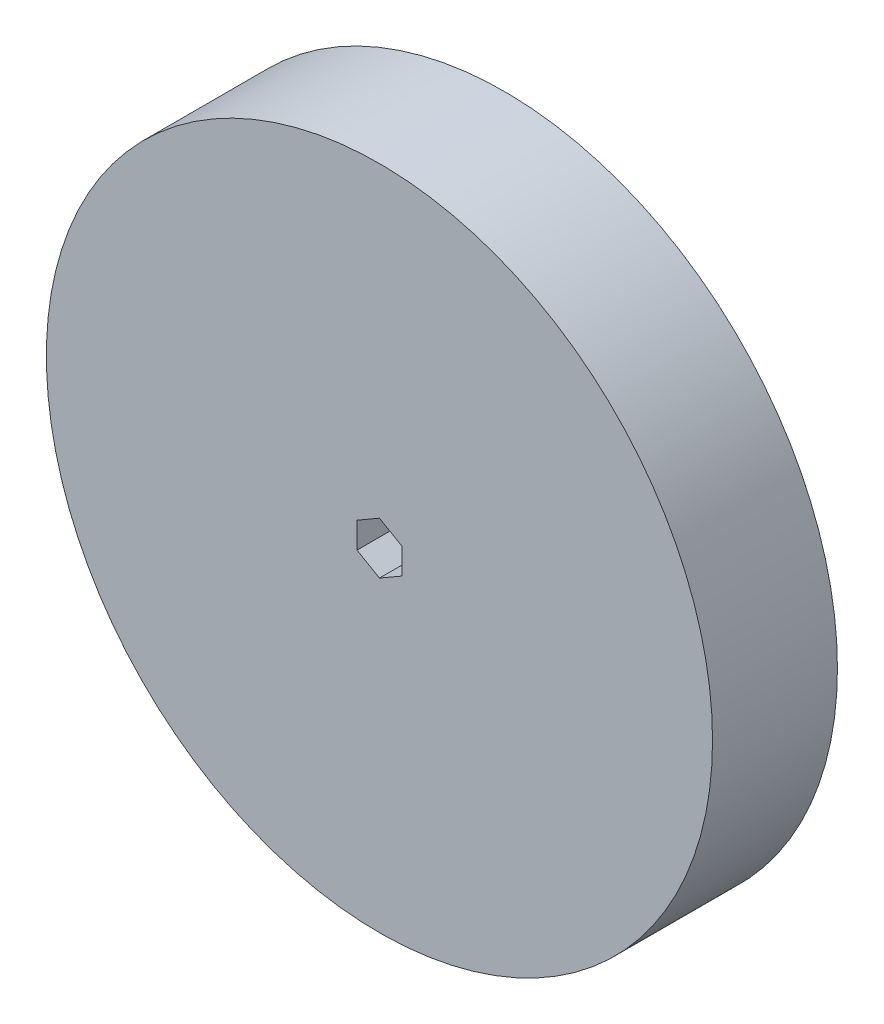
ISO-10303-21;
HEADER;
FILE_DESCRIPTION(('STEP AP214'),'2;1');
FILE_NAME('part.step','',(''),(''),'','','');
FILE_SCHEMA(('AUTOMOTIVE_DESIGN { 1 0 10303 214 1 1 1 1 }'));
ENDSEC;
DATA;
#1=APPLICATION_CONTEXT('core data for automotive mechanical design processes');
#2=APPLICATION_PROTOCOL_DEFINITION('international standard','automotive_design',2000,#1);
#3=PRODUCT_CONTEXT('',#1,'mechanical');
#4=PRODUCT('Part','Part','',(#3));
#5=PRODUCT_RELATED_PRODUCT_CATEGORY('part','',(#4));
#6=PRODUCT_DEFINITION_FORMATION('','',#4);
#7=PRODUCT_DEFINITION_CONTEXT('part definition',#1,'design');
#8=PRODUCT_DEFINITION('design','',#6,#7);
#9=PRODUCT_DEFINITION_SHAPE('','',#8);
#10=(LENGTH_UNIT() NAMED_UNIT(*) SI_UNIT(.MILLI.,.METRE.));
#11=(NAMED_UNIT(*) PLANE_ANGLE_UNIT() SI_UNIT($,.RADIAN.));
#12=(NAMED_UNIT(*) SI_UNIT($,.STERADIAN.) SOLID_ANGLE_UNIT());
#13=UNCERTAINTY_MEASURE_WITH_UNIT(LENGTH_MEASURE(1.E-05),#10,'distance_accuracy_value','');
#14=(GEOMETRIC_REPRESENTATION_CONTEXT(3) GLOBAL_UNCERTAINTY_ASSIGNED_CONTEXT((#13)) GLOBAL_UNIT_ASSIGNED_CONTEXT((#10,
#11,#12)) REPRESENTATION_CONTEXT('',''));
#15=CARTESIAN_POINT('',(0.,0.,0.));
#16=DIRECTION('',(0.,0.,1.));
#17=DIRECTION('',(1.,0.,0.));
#18=AXIS2_PLACEMENT_3D('',#15,#16,#17);
#19=CARTESIAN_POINT('',(0.,0.,-38.1));
#20=DIRECTION('',(0.,0.,1.));
#21=DIRECTION('',(1.,0.,0.));
#22=AXIS2_PLACEMENT_3D('',#19,#20,#21);
#23=CYLINDRICAL_SURFACE('',#22,101.6);
#24=CARTESIAN_POINT('',(0.,0.,-38.1));
#25=DIRECTION('',(0.,0.,1.));
#26=DIRECTION('',(1.,0.,0.));
#27=AXIS2_PLACEMENT_3D('',#24,#25,#26);
#28=CIRCLE('',#27,101.6);
#29=CARTESIAN_POINT('',(101.6,0.,-38.1));
#30=VERTEX_POINT('',#29);
#31=EDGE_CURVE('E11',#30,#30,#28,.T.);
#32=CARTESIAN_POINT('',(0.,0.,0.));
#33=DIRECTION('',(0.,0.,1.));
#34=DIRECTION('',(1.,0.,0.));
#35=AXIS2_PLACEMENT_3D('',#32,#33,#34);
#36=CIRCLE('',#35,101.6);
#37=CARTESIAN_POINT('',(101.6,0.,0.));
#38=VERTEX_POINT('',#37);
#39=EDGE_CURVE('E42',#38,#38,#36,.T.);
#40=CARTESIAN_POINT('',(101.6,0.,-38.1));
#41=CARTESIAN_POINT('',(101.6,0.,-37.703125));
#42=CARTESIAN_POINT('',(101.6,0.,-37.30625));
#43=CARTESIAN_POINT('',(101.6,0.,-36.5125));
#44=CARTESIAN_POINT('',(101.6,0.,-36.115625));
#45=CARTESIAN_POINT('',(101.6,0.,-35.321875));
#46=CARTESIAN_POINT('',(101.6,0.,-34.925));
#47=CARTESIAN_POINT('',(101.6,0.,-34.13125));
#48=CARTESIAN_POINT('',(101.6,0.,-33.734375));
#49=CARTESIAN_POINT('',(101.6,0.,-32.940625));
#50=CARTESIAN_POINT('',(101.6,0.,-32.54375));
#51=CARTESIAN_POINT('',(101.6,0.,-31.75));
#52=CARTESIAN_POINT('',(101.6,0.,-31.353125));
#53=CARTESIAN_POINT('',(101.6,0.,-30.559375));
#54=CARTESIAN_POINT('',(101.6,0.,-30.1625));
#55=CARTESIAN_POINT('',(101.6,0.,-29.36875));
#56=CARTESIAN_POINT('',(101.6,0.,-28.971875));
#57=CARTESIAN_POINT('',(101.6,0.,-28.178125));
#58=CARTESIAN_POINT('',(101.6,0.,-27.78125));
#59=CARTESIAN_POINT('',(101.6,0.,-26.9875));
#60=CARTESIAN_POINT('',(101.6,0.,-26.590625));
#61=CARTESIAN_POINT('',(101.6,0.,-25.796875));
#62=CARTESIAN_POINT('',(101.6,0.,-25.4));
#63=CARTESIAN_POINT('',(101.6,0.,-24.60625));
#64=CARTESIAN_POINT('',(101.6,0.,-24.209375));
#65=CARTESIAN_POINT('',(101.6,0.,-23.415625));
#66=CARTESIAN_POINT('',(101.6,0.,-23.01875));
#67=CARTESIAN_POINT('',(101.6,0.,-22.225));
#68=CARTESIAN_POINT('',(101.6,0.,-21.828125));
#69=CARTESIAN_POINT('',(101.6,0.,-21.034375));
#70=CARTESIAN_POINT('',(101.6,0.,-20.6375));
#71=CARTESIAN_POINT('',(101.6,0.,-19.84375));
#72=CARTESIAN_POINT('',(101.6,0.,-19.446875));
#73=CARTESIAN_POINT('',(101.6,0.,-18.653125));
#74=CARTESIAN_POINT('',(101.6,0.,-18.25625));
#75=CARTESIAN_POINT('',(101.6,0.,-17.4625));
#76=CARTESIAN_POINT('',(101.6,0.,-17.065625));
#77=CARTESIAN_POINT('',(101.6,0.,-16.271875));
#78=CARTESIAN_POINT('',(101.6,0.,-15.875));
#79=CARTESIAN_POINT('',(101.6,0.,-15.08125));
#80=CARTESIAN_POINT('',(101.6,0.,-14.684375));
#81=CARTESIAN_POINT('',(101.6,0.,-13.890625));
#82=CARTESIAN_POINT('',(101.6,0.,-13.49375));
#83=CARTESIAN_POINT('',(101.6,0.,-12.7));
#84=CARTESIAN_POINT('',(101.6,0.,-12.303125));
#85=CARTESIAN_POINT('',(101.6,0.,-11.509375));
#86=CARTESIAN_POINT('',(101.6,0.,-11.1125));
#87=CARTESIAN_POINT('',(101.6,0.,-10.31875));
#88=CARTESIAN_POINT('',(101.6,0.,-9.921875));
#89=CARTESIAN_POINT('',(101.6,0.,-9.128125));
#90=CARTESIAN_POINT('',(101.6,0.,-8.73125));
#91=CARTESIAN_POINT('',(101.6,0.,-7.9375));
#92=CARTESIAN_POINT('',(101.6,0.,-7.540625));
#93=CARTESIAN_POINT('',(101.6,0.,-6.746875));
#94=CARTESIAN_POINT('',(101.6,0.,-6.35));
#95=CARTESIAN_POINT('',(101.6,0.,-5.55625));
#96=CARTESIAN_POINT('',(101.6,0.,-5.159375));
#97=CARTESIAN_POINT('',(101.6,0.,-4.365625));
#98=CARTESIAN_POINT('',(101.6,0.,-3.96875));
#99=CARTESIAN_POINT('',(101.6,0.,-3.175));
#100=CARTESIAN_POINT('',(101.6,0.,-2.778125));
#101=CARTESIAN_POINT('',(101.6,0.,-1.984375));
#102=CARTESIAN_POINT('',(101.6,0.,-1.5875));
#103=CARTESIAN_POINT('',(101.6,0.,-0.79375));
#104=CARTESIAN_POINT('',(101.6,0.,-0.396875));
#105=CARTESIAN_POINT('',(101.6,0.,0.));
#106=B_SPLINE_CURVE_WITH_KNOTS('',3,(#40,#41,#42,#43,#44,#45,#46,#47,#48,#49,#50,#51,#52,#53,
#54,#55,#56,#57,#58,#59,#60,#61,#62,#63,#64,#65,#66,#67,#68,#69,#70,#71,#72,#73,#74,#75,#76,#77,
#78,#79,#80,#81,#82,#83,#84,#85,#86,#87,#88,#89,#90,#91,#92,#93,#94,#95,#96,#97,#98,#99,#100,
#101,#102,#103,#104,#105),.UNSPECIFIED.,.F.,.F.,(4,2,2,2,2,2,2,2,2,2,2,2,2,2,2,2,2,2,2,2,2,2,2,
2,2,2,2,2,2,2,2,2,4),(0.,1.190625,2.38125,3.571875,4.7625,5.953125,7.14375,8.334375,
9.52500000000001,10.715625,11.90625,13.096875,14.2875,15.478125,16.66875,17.859375,19.05,
20.240625,21.43125,22.621875,23.8125,25.003125,26.19375,27.384375,28.575,29.765625,30.95625,
32.146875,33.3375,34.528125,35.71875,36.909375,38.1),.UNSPECIFIED.);
#107=EDGE_CURVE('BSEAM39',#30,#38,#106,.T.);
#108=ORIENTED_EDGE('',*,*,#31,.T.);
#109=ORIENTED_EDGE('',*,*,#39,.F.);
#110=ORIENTED_EDGE('',*,*,#107,.T.);
#111=ORIENTED_EDGE('',*,*,#107,.F.);
#112=EDGE_LOOP('',(#108,#110,#109,#111));
#113=FACE_BOUND('',#112,.T.);
#114=ADVANCED_FACE('F39',(#113),#23,.T.);
#115=CARTESIAN_POINT('',(0.,0.,-38.1));
#116=DIRECTION('',(0.,0.,1.));
#117=DIRECTION('',(1.,0.,0.));
#118=AXIS2_PLACEMENT_3D('',#115,#116,#117);
#119=PLANE('',#118);
#120=DIRECTION('',(0.,1.,0.));
#121=VECTOR('',#120,1.);
#122=CARTESIAN_POINT('',(6.85,-3.95484934394894,-38.1));
#123=LINE('',#122,#121);
#124=CARTESIAN_POINT('',(6.85,-3.95484934394894,-38.1));
#125=VERTEX_POINT('',#124);
#126=CARTESIAN_POINT('',(6.85,3.95484934394894,-38.1));
#127=VERTEX_POINT('',#126);
#128=EDGE_CURVE('E99',#125,#127,#123,.T.);
#129=ORIENTED_EDGE('',*,*,#128,.T.);
#130=DIRECTION('',(-0.866025403784439,0.5,0.));
#131=VECTOR('',#130,1.);
#132=CARTESIAN_POINT('',(6.85,3.95484934394894,-38.1));
#133=LINE('',#132,#131);
#134=CARTESIAN_POINT('',(0.,7.90969868789787,-38.1));
#135=VERTEX_POINT('',#134);
#136=EDGE_CURVE('E93',#127,#135,#133,.T.);
#137=ORIENTED_EDGE('',*,*,#136,.T.);
#138=DIRECTION('',(-0.866025403784439,-0.5,0.));
#139=VECTOR('',#138,1.);
#140=CARTESIAN_POINT('',(0.,7.90969868789787,-38.1));
#141=LINE('',#140,#139);
#142=CARTESIAN_POINT('',(-6.85,3.95484934394894,-38.1));
#143=VERTEX_POINT('',#142);
#144=EDGE_CURVE('E102',#135,#143,#141,.T.);
#145=ORIENTED_EDGE('',*,*,#144,.T.);
#146=DIRECTION('',(0.,-1.,0.));
#147=VECTOR('',#146,1.);
#148=CARTESIAN_POINT('',(-6.85,3.95484934394894,-38.1));
#149=LINE('',#148,#147);
#150=CARTESIAN_POINT('',(-6.85,-3.95484934394894,-38.1));
#151=VERTEX_POINT('',#150);
#152=EDGE_CURVE('E53',#143,#151,#149,.T.);
#153=ORIENTED_EDGE('',*,*,#152,.T.);
#154=DIRECTION('',(0.866025403784439,-0.5,0.));
#155=VECTOR('',#154,1.);
#156=CARTESIAN_POINT('',(-6.85,-3.95484934394894,-38.1));
#157=LINE('',#156,#155);
#158=CARTESIAN_POINT('',(0.,-7.90969868789787,-38.1));
#159=VERTEX_POINT('',#158);
#160=EDGE_CURVE('E117',#151,#159,#157,.T.);
#161=ORIENTED_EDGE('',*,*,#160,.T.);
#162=DIRECTION('',(0.866025403784438,0.5,0.));
#163=VECTOR('',#162,1.);
#164=CARTESIAN_POINT('',(0.,-7.90969868789787,-38.1));
#165=LINE('',#164,#163);
#166=EDGE_CURVE('E120',#159,#125,#165,.T.);
#167=ORIENTED_EDGE('',*,*,#166,.T.);
#168=EDGE_LOOP('',(#129,#137,#145,#153,#161,#167));
#169=FACE_BOUND('',#168,.T.);
#170=ORIENTED_EDGE('',*,*,#31,.F.);
#171=EDGE_LOOP('',(#170));
#172=FACE_BOUND('',#171,.T.);
#173=ADVANCED_FACE('F106',(#169,#172),#119,.F.);
#174=CARTESIAN_POINT('',(0.,0.,0.));
#175=DIRECTION('',(0.,0.,1.));
#176=DIRECTION('',(1.,0.,0.));
#177=AXIS2_PLACEMENT_3D('',#174,#175,#176);
#178=PLANE('',#177);
#179=DIRECTION('',(-0.866025403784439,0.5,0.));
#180=VECTOR('',#179,1.);
#181=CARTESIAN_POINT('',(6.85,3.95484934394894,0.));
#182=LINE('',#181,#180);
#183=CARTESIAN_POINT('',(6.85,3.95484934394894,0.));
#184=VERTEX_POINT('',#183);
#185=CARTESIAN_POINT('',(0.,7.90969868789787,0.));
#186=VERTEX_POINT('',#185);
#187=EDGE_CURVE('E61',#184,#186,#182,.T.);
#188=ORIENTED_EDGE('',*,*,#187,.F.);
#189=DIRECTION('',(0.,1.,0.));
#190=VECTOR('',#189,1.);
#191=CARTESIAN_POINT('',(6.85,-3.95484934394894,0.));
#192=LINE('',#191,#190);
#193=CARTESIAN_POINT('',(6.85,-3.95484934394894,0.));
#194=VERTEX_POINT('',#193);
#195=EDGE_CURVE('E110',#194,#184,#192,.T.);
#196=ORIENTED_EDGE('',*,*,#195,.F.);
#197=DIRECTION('',(0.866025403784438,0.5,0.));
#198=VECTOR('',#197,1.);
#199=CARTESIAN_POINT('',(0.,-7.90969868789787,0.));
#200=LINE('',#199,#198);
#201=CARTESIAN_POINT('',(0.,-7.90969868789787,0.));
#202=VERTEX_POINT('',#201);
#203=EDGE_CURVE('E113',#202,#194,#200,.T.);
#204=ORIENTED_EDGE('',*,*,#203,.F.);
#205=DIRECTION('',(0.866025403784439,-0.5,0.));
#206=VECTOR('',#205,1.);
#207=CARTESIAN_POINT('',(-6.85,-3.95484934394894,0.));
#208=LINE('',#207,#206);
#209=CARTESIAN_POINT('',(-6.85,-3.95484934394894,0.));
#210=VERTEX_POINT('',#209);
#211=EDGE_CURVE('E129',#210,#202,#208,.T.);
#212=ORIENTED_EDGE('',*,*,#211,.F.);
#213=DIRECTION('',(0.,-1.,0.));
#214=VECTOR('',#213,1.);
#215=CARTESIAN_POINT('',(-6.85,3.95484934394894,0.));
#216=LINE('',#215,#214);
#217=CARTESIAN_POINT('',(-6.85,3.95484934394894,0.));
#218=VERTEX_POINT('',#217);
#219=EDGE_CURVE('E126',#218,#210,#216,.T.);
#220=ORIENTED_EDGE('',*,*,#219,.F.);
#221=DIRECTION('',(-0.866025403784439,-0.5,0.));
#222=VECTOR('',#221,1.);
#223=CARTESIAN_POINT('',(0.,7.90969868789787,0.));
#224=LINE('',#223,#222);
#225=EDGE_CURVE('E124',#186,#218,#224,.T.);
#226=ORIENTED_EDGE('',*,*,#225,.F.);
#227=EDGE_LOOP('',(#188,#196,#204,#212,#220,#226));
#228=FACE_BOUND('',#227,.T.);
#229=ORIENTED_EDGE('',*,*,#39,.T.);
#230=EDGE_LOOP('',(#229));
#231=FACE_BOUND('',#230,.T.);
#232=ADVANCED_FACE('F146',(#228,#231),#178,.T.);
#233=CARTESIAN_POINT('',(6.85,3.95484934394894,-38.1));
#234=DIRECTION('',(0.5,0.866025403784439,0.));
#235=DIRECTION('',(-0.866025403784439,0.5,0.));
#236=AXIS2_PLACEMENT_3D('',#233,#234,#235);
#237=PLANE('',#236);
#238=ORIENTED_EDGE('',*,*,#187,.T.);
#239=DIRECTION('',(0.,0.,1.));
#240=VECTOR('',#239,1.);
#241=CARTESIAN_POINT('',(0.,7.90969868789787,-38.1));
#242=LINE('',#241,#240);
#243=EDGE_CURVE('E89',#135,#186,#242,.T.);
#244=ORIENTED_EDGE('',*,*,#243,.F.);
#245=ORIENTED_EDGE('',*,*,#136,.F.);
#246=DIRECTION('',(0.,0.,1.));
#247=VECTOR('',#246,1.);
#248=CARTESIAN_POINT('',(6.85,3.95484934394894,-38.1));
#249=LINE('',#248,#247);
#250=EDGE_CURVE('E134',#127,#184,#249,.T.);
#251=ORIENTED_EDGE('',*,*,#250,.T.);
#252=EDGE_LOOP('',(#238,#244,#245,#251));
#253=FACE_BOUND('',#252,.T.);
#254=ADVANCED_FACE('F91',(#253),#237,.F.);
#255=CARTESIAN_POINT('',(6.85,-3.95484934394894,-38.1));
#256=DIRECTION('',(1.,0.,0.));
#257=DIRECTION('',(0.,1.,0.));
#258=AXIS2_PLACEMENT_3D('',#255,#256,#257);
#259=PLANE('',#258);
#260=ORIENTED_EDGE('',*,*,#195,.T.);
#261=ORIENTED_EDGE('',*,*,#250,.F.);
#262=ORIENTED_EDGE('',*,*,#128,.F.);
#263=DIRECTION('',(0.,0.,1.));
#264=VECTOR('',#263,1.);
#265=CARTESIAN_POINT('',(6.85,-3.95484934394894,-38.1));
#266=LINE('',#265,#264);
#267=EDGE_CURVE('E136',#125,#194,#266,.T.);
#268=ORIENTED_EDGE('',*,*,#267,.T.);
#269=EDGE_LOOP('',(#260,#261,#262,#268));
#270=FACE_BOUND('',#269,.T.);
#271=ADVANCED_FACE('F157',(#270),#259,.F.);
#272=CARTESIAN_POINT('',(0.,-7.90969868789787,-38.1));
#273=DIRECTION('',(0.5,-0.866025403784439,0.));
#274=DIRECTION('',(0.866025403784439,0.5,0.));
#275=AXIS2_PLACEMENT_3D('',#272,#273,#274);
#276=PLANE('',#275);
#277=ORIENTED_EDGE('',*,*,#203,.T.);
#278=ORIENTED_EDGE('',*,*,#267,.F.);
#279=ORIENTED_EDGE('',*,*,#166,.F.);
#280=DIRECTION('',(0.,0.,1.));
#281=VECTOR('',#280,1.);
#282=CARTESIAN_POINT('',(0.,-7.90969868789787,-38.1));
#283=LINE('',#282,#281);
#284=EDGE_CURVE('E138',#159,#202,#283,.T.);
#285=ORIENTED_EDGE('',*,*,#284,.T.);
#286=EDGE_LOOP('',(#277,#278,#279,#285));
#287=FACE_BOUND('',#286,.T.);
#288=ADVANCED_FACE('F155',(#287),#276,.F.);
#289=CARTESIAN_POINT('',(-6.85,-3.95484934394894,-38.1));
#290=DIRECTION('',(-0.5,-0.866025403784439,0.));
#291=DIRECTION('',(0.866025403784439,-0.5,0.));
#292=AXIS2_PLACEMENT_3D('',#289,#290,#291);
#293=PLANE('',#292);
#294=ORIENTED_EDGE('',*,*,#211,.T.);
#295=ORIENTED_EDGE('',*,*,#284,.F.);
#296=ORIENTED_EDGE('',*,*,#160,.F.);
#297=DIRECTION('',(0.,0.,1.));
#298=VECTOR('',#297,1.);
#299=CARTESIAN_POINT('',(-6.85,-3.95484934394894,-38.1));
#300=LINE('',#299,#298);
#301=EDGE_CURVE('E140',#151,#210,#300,.T.);
#302=ORIENTED_EDGE('',*,*,#301,.T.);
#303=EDGE_LOOP('',(#294,#295,#296,#302));
#304=FACE_BOUND('',#303,.T.);
#305=ADVANCED_FACE('F151',(#304),#293,.F.);
#306=CARTESIAN_POINT('',(-6.85,3.95484934394894,-38.1));
#307=DIRECTION('',(-1.,0.,0.));
#308=DIRECTION('',(0.,-1.,0.));
#309=AXIS2_PLACEMENT_3D('',#306,#307,#308);
#310=PLANE('',#309);
#311=ORIENTED_EDGE('',*,*,#219,.T.);
#312=ORIENTED_EDGE('',*,*,#301,.F.);
#313=ORIENTED_EDGE('',*,*,#152,.F.);
#314=DIRECTION('',(0.,0.,1.));
#315=VECTOR('',#314,1.);
#316=CARTESIAN_POINT('',(-6.85,3.95484934394894,-38.1));
#317=LINE('',#316,#315);
#318=EDGE_CURVE('E98',#143,#218,#317,.T.);
#319=ORIENTED_EDGE('',*,*,#318,.T.);
#320=EDGE_LOOP('',(#311,#312,#313,#319));
#321=FACE_BOUND('',#320,.T.);
#322=ADVANCED_FACE('F142',(#321),#310,.F.);
#323=CARTESIAN_POINT('',(0.,7.90969868789787,-38.1));
#324=DIRECTION('',(-0.5,0.866025403784439,0.));
#325=DIRECTION('',(-0.866025403784438,-0.5,0.));
#326=AXIS2_PLACEMENT_3D('',#323,#324,#325);
#327=PLANE('',#326);
#328=ORIENTED_EDGE('',*,*,#225,.T.);
#329=ORIENTED_EDGE('',*,*,#318,.F.);
#330=ORIENTED_EDGE('',*,*,#144,.F.);
#331=ORIENTED_EDGE('',*,*,#243,.T.);
#332=EDGE_LOOP('',(#328,#329,#330,#331));
#333=FACE_BOUND('',#332,.T.);
#334=ADVANCED_FACE('F103',(#333),#327,.F.);
#335=CLOSED_SHELL('',(#114,#173,#232,#254,#271,#288,#305,#322,#334));
#336=MANIFOLD_SOLID_BREP('B2',#335);
#337=ADVANCED_BREP_SHAPE_REPRESENTATION('',(#18,#336),#14);
#338=SHAPE_DEFINITION_REPRESENTATION(#9,#337);
ENDSEC;
END-ISO-10303-21;
